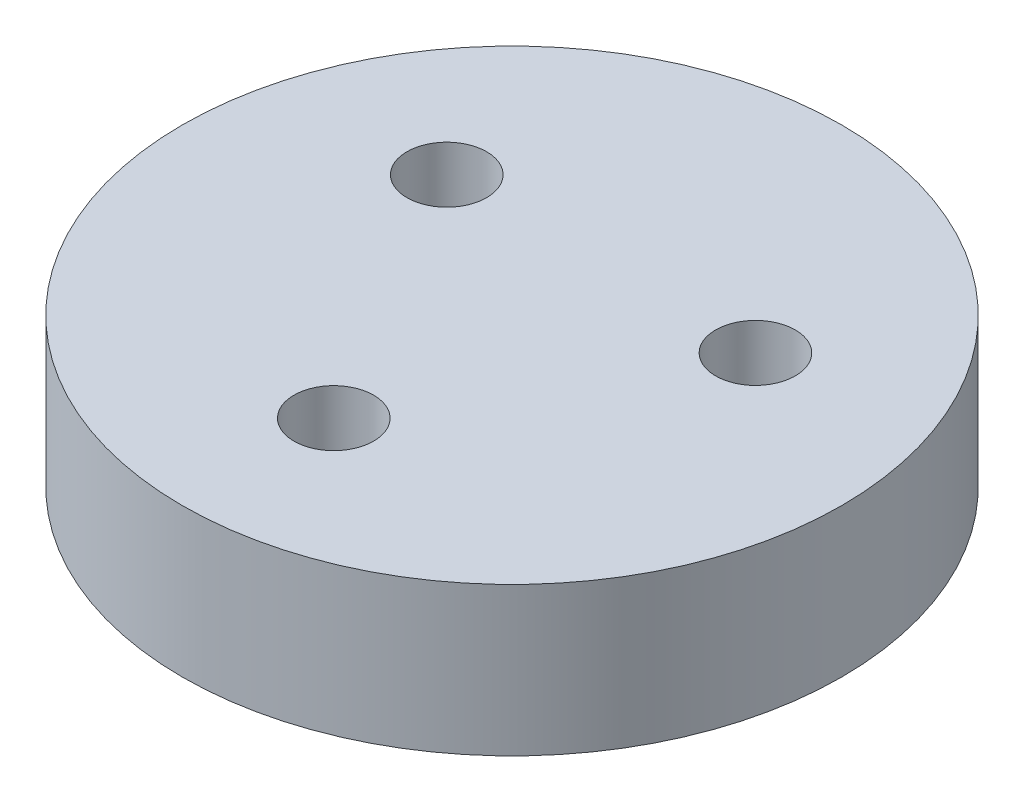
ISO-10303-21;
HEADER;
FILE_DESCRIPTION(('STEP AP214'),'2;1');
FILE_NAME('part.step','',(''),(''),'','','');
FILE_SCHEMA(('AUTOMOTIVE_DESIGN { 1 0 10303 214 1 1 1 1 }'));
ENDSEC;
DATA;
#1=APPLICATION_CONTEXT('core data for automotive mechanical design processes');
#2=APPLICATION_PROTOCOL_DEFINITION('international standard','automotive_design',2000,#1);
#3=PRODUCT_CONTEXT('',#1,'mechanical');
#4=PRODUCT('Part','Part','',(#3));
#5=PRODUCT_RELATED_PRODUCT_CATEGORY('part','',(#4));
#6=PRODUCT_DEFINITION_FORMATION('','',#4);
#7=PRODUCT_DEFINITION_CONTEXT('part definition',#1,'design');
#8=PRODUCT_DEFINITION('design','',#6,#7);
#9=PRODUCT_DEFINITION_SHAPE('','',#8);
#10=(LENGTH_UNIT() NAMED_UNIT(*) SI_UNIT(.MILLI.,.METRE.));
#11=(NAMED_UNIT(*) PLANE_ANGLE_UNIT() SI_UNIT($,.RADIAN.));
#12=(NAMED_UNIT(*) SI_UNIT($,.STERADIAN.) SOLID_ANGLE_UNIT());
#13=UNCERTAINTY_MEASURE_WITH_UNIT(LENGTH_MEASURE(1.E-05),#10,'distance_accuracy_value','');
#14=(GEOMETRIC_REPRESENTATION_CONTEXT(3) GLOBAL_UNCERTAINTY_ASSIGNED_CONTEXT((#13)) GLOBAL_UNIT_ASSIGNED_CONTEXT((#10,
#11,#12)) REPRESENTATION_CONTEXT('',''));
#15=CARTESIAN_POINT('',(0.,0.,0.));
#16=DIRECTION('',(0.,0.,1.));
#17=DIRECTION('',(1.,0.,0.));
#18=AXIS2_PLACEMENT_3D('',#15,#16,#17);
#19=CARTESIAN_POINT('',(0.,15.,0.));
#20=DIRECTION('',(0.,-1.,0.));
#21=DIRECTION('',(0.,0.,-1.));
#22=AXIS2_PLACEMENT_3D('',#19,#20,#21);
#23=CYLINDRICAL_SURFACE('',#22,33.3);
#24=CARTESIAN_POINT('',(0.,15.,0.));
#25=DIRECTION('',(0.,1.,0.));
#26=DIRECTION('',(0.,0.,1.));
#27=AXIS2_PLACEMENT_3D('',#24,#25,#26);
#28=CIRCLE('',#27,33.3);
#29=CARTESIAN_POINT('',(0.,15.,33.3));
#30=VERTEX_POINT('',#29);
#31=EDGE_CURVE('E55',#30,#30,#28,.T.);
#32=ORIENTED_EDGE('',*,*,#31,.F.);
#33=EDGE_LOOP('',(#32));
#34=FACE_BOUND('',#33,.T.);
#35=CARTESIAN_POINT('',(0.,0.,0.));
#36=DIRECTION('',(0.,1.,0.));
#37=DIRECTION('',(0.,0.,1.));
#38=AXIS2_PLACEMENT_3D('',#35,#36,#37);
#39=CIRCLE('',#38,33.3);
#40=CARTESIAN_POINT('',(0.,0.,33.3));
#41=VERTEX_POINT('',#40);
#42=EDGE_CURVE('E60',#41,#41,#39,.T.);
#43=ORIENTED_EDGE('',*,*,#42,.T.);
#44=EDGE_LOOP('',(#43));
#45=FACE_BOUND('',#44,.T.);
#46=ADVANCED_FACE('F42',(#34,#45),#23,.T.);
#47=CARTESIAN_POINT('',(0.,15.,0.));
#48=DIRECTION('',(0.,1.,0.));
#49=DIRECTION('',(0.,0.,1.));
#50=AXIS2_PLACEMENT_3D('',#47,#48,#49);
#51=PLANE('',#50);
#52=CARTESIAN_POINT('',(0.,15.,18.));
#53=DIRECTION('',(0.,-1.,0.));
#54=DIRECTION('',(0.,0.,-1.));
#55=AXIS2_PLACEMENT_3D('',#52,#53,#54);
#56=CIRCLE('',#55,4.025);
#57=CARTESIAN_POINT('',(0.,15.,13.975));
#58=VERTEX_POINT('',#57);
#59=EDGE_CURVE('E65',#58,#58,#56,.T.);
#60=ORIENTED_EDGE('',*,*,#59,.T.);
#61=EDGE_LOOP('',(#60));
#62=FACE_BOUND('',#61,.T.);
#63=CARTESIAN_POINT('',(15.5884572681212,15.,-8.99999999999926));
#64=DIRECTION('',(0.,-1.,0.));
#65=DIRECTION('',(0.,0.,-1.));
#66=AXIS2_PLACEMENT_3D('',#63,#64,#65);
#67=CIRCLE('',#66,4.025);
#68=CARTESIAN_POINT('',(15.5884572681212,15.,-13.0249999999993));
#69=VERTEX_POINT('',#68);
#70=EDGE_CURVE('E76',#69,#69,#67,.T.);
#71=ORIENTED_EDGE('',*,*,#70,.T.);
#72=EDGE_LOOP('',(#71));
#73=FACE_BOUND('',#72,.T.);
#74=CARTESIAN_POINT('',(-15.5884572681186,15.,-9.00000000000073));
#75=DIRECTION('',(0.,-1.,0.));
#76=DIRECTION('',(0.,0.,-1.));
#77=AXIS2_PLACEMENT_3D('',#74,#75,#76);
#78=CIRCLE('',#77,4.025);
#79=CARTESIAN_POINT('',(-15.5884572681186,15.,-13.0250000000007));
#80=VERTEX_POINT('',#79);
#81=EDGE_CURVE('E67',#80,#80,#78,.T.);
#82=ORIENTED_EDGE('',*,*,#81,.T.);
#83=EDGE_LOOP('',(#82));
#84=FACE_BOUND('',#83,.T.);
#85=ORIENTED_EDGE('',*,*,#31,.T.);
#86=EDGE_LOOP('',(#85));
#87=FACE_BOUND('',#86,.T.);
#88=ADVANCED_FACE('F112',(#62,#73,#84,#87),#51,.T.);
#89=CARTESIAN_POINT('',(0.,0.,0.));
#90=DIRECTION('',(0.,1.,0.));
#91=DIRECTION('',(0.,0.,1.));
#92=AXIS2_PLACEMENT_3D('',#89,#90,#91);
#93=PLANE('',#92);
#94=CARTESIAN_POINT('',(0.,0.,0.));
#95=DIRECTION('',(0.,1.,0.));
#96=DIRECTION('',(0.,0.,1.));
#97=AXIS2_PLACEMENT_3D('',#94,#95,#96);
#98=CIRCLE('',#97,10.);
#99=CARTESIAN_POINT('',(0.,0.,10.));
#100=VERTEX_POINT('',#99);
#101=EDGE_CURVE('E10',#100,#100,#98,.T.);
#102=ORIENTED_EDGE('',*,*,#101,.T.);
#103=EDGE_LOOP('',(#102));
#104=FACE_BOUND('',#103,.T.);
#105=CARTESIAN_POINT('',(0.,0.,18.));
#106=DIRECTION('',(0.,-1.,0.));
#107=DIRECTION('',(0.,0.,-1.));
#108=AXIS2_PLACEMENT_3D('',#105,#106,#107);
#109=CIRCLE('',#108,4.025);
#110=CARTESIAN_POINT('',(0.,0.,13.975));
#111=VERTEX_POINT('',#110);
#112=EDGE_CURVE('E84',#111,#111,#109,.T.);
#113=ORIENTED_EDGE('',*,*,#112,.F.);
#114=EDGE_LOOP('',(#113));
#115=FACE_BOUND('',#114,.T.);
#116=CARTESIAN_POINT('',(15.5884572681212,0.,-8.99999999999926));
#117=DIRECTION('',(0.,-1.,0.));
#118=DIRECTION('',(0.,0.,-1.));
#119=AXIS2_PLACEMENT_3D('',#116,#117,#118);
#120=CIRCLE('',#119,4.025);
#121=CARTESIAN_POINT('',(15.5884572681212,0.,-13.0249999999993));
#122=VERTEX_POINT('',#121);
#123=EDGE_CURVE('E80',#122,#122,#120,.T.);
#124=ORIENTED_EDGE('',*,*,#123,.F.);
#125=EDGE_LOOP('',(#124));
#126=FACE_BOUND('',#125,.T.);
#127=CARTESIAN_POINT('',(-15.5884572681186,0.,-9.00000000000073));
#128=DIRECTION('',(0.,-1.,0.));
#129=DIRECTION('',(0.,0.,-1.));
#130=AXIS2_PLACEMENT_3D('',#127,#128,#129);
#131=CIRCLE('',#130,4.025);
#132=CARTESIAN_POINT('',(-15.5884572681186,0.,-13.0250000000007));
#133=VERTEX_POINT('',#132);
#134=EDGE_CURVE('E71',#133,#133,#131,.T.);
#135=ORIENTED_EDGE('',*,*,#134,.F.);
#136=EDGE_LOOP('',(#135));
#137=FACE_BOUND('',#136,.T.);
#138=ORIENTED_EDGE('',*,*,#42,.F.);
#139=EDGE_LOOP('',(#138));
#140=FACE_BOUND('',#139,.T.);
#141=ADVANCED_FACE('F117',(#104,#115,#126,#137,#140),#93,.F.);
#142=CARTESIAN_POINT('',(-15.5884572681186,15.,-9.00000000000073));
#143=DIRECTION('',(0.,-1.,0.));
#144=DIRECTION('',(0.,0.,-1.));
#145=AXIS2_PLACEMENT_3D('',#142,#143,#144);
#146=CYLINDRICAL_SURFACE('',#145,4.025);
#147=ORIENTED_EDGE('',*,*,#81,.F.);
#148=EDGE_LOOP('',(#147));
#149=FACE_BOUND('',#148,.T.);
#150=ORIENTED_EDGE('',*,*,#134,.T.);
#151=EDGE_LOOP('',(#150));
#152=FACE_BOUND('',#151,.T.);
#153=ADVANCED_FACE('F123',(#149,#152),#146,.F.);
#154=CARTESIAN_POINT('',(15.5884572681212,15.,-8.99999999999926));
#155=DIRECTION('',(0.,-1.,0.));
#156=DIRECTION('',(0.,0.,-1.));
#157=AXIS2_PLACEMENT_3D('',#154,#155,#156);
#158=CYLINDRICAL_SURFACE('',#157,4.025);
#159=ORIENTED_EDGE('',*,*,#70,.F.);
#160=EDGE_LOOP('',(#159));
#161=FACE_BOUND('',#160,.T.);
#162=ORIENTED_EDGE('',*,*,#123,.T.);
#163=EDGE_LOOP('',(#162));
#164=FACE_BOUND('',#163,.T.);
#165=ADVANCED_FACE('F108',(#161,#164),#158,.F.);
#166=CARTESIAN_POINT('',(0.,15.,18.));
#167=DIRECTION('',(0.,-1.,0.));
#168=DIRECTION('',(0.,0.,-1.));
#169=AXIS2_PLACEMENT_3D('',#166,#167,#168);
#170=CYLINDRICAL_SURFACE('',#169,4.025);
#171=ORIENTED_EDGE('',*,*,#59,.F.);
#172=EDGE_LOOP('',(#171));
#173=FACE_BOUND('',#172,.T.);
#174=ORIENTED_EDGE('',*,*,#112,.T.);
#175=EDGE_LOOP('',(#174));
#176=FACE_BOUND('',#175,.T.);
#177=ADVANCED_FACE('F99',(#173,#176),#170,.F.);
#178=CARTESIAN_POINT('',(0.,-10.,0.));
#179=DIRECTION('',(0.,1.,0.));
#180=DIRECTION('',(0.,0.,1.));
#181=AXIS2_PLACEMENT_3D('',#178,#179,#180);
#182=CYLINDRICAL_SURFACE('',#181,7.5);
#183=CARTESIAN_POINT('',(0.,-2.5,0.));
#184=DIRECTION('',(0.,1.,0.));
#185=DIRECTION('',(0.,0.,1.));
#186=AXIS2_PLACEMENT_3D('',#183,#184,#185);
#187=CIRCLE('',#186,7.5);
#188=CARTESIAN_POINT('',(0.,-2.5,7.5));
#189=VERTEX_POINT('',#188);
#190=EDGE_CURVE('E50',#189,#189,#187,.F.);
#191=ORIENTED_EDGE('',*,*,#190,.T.);
#192=EDGE_LOOP('',(#191));
#193=FACE_BOUND('',#192,.T.);
#194=CARTESIAN_POINT('',(0.,-10.,0.));
#195=DIRECTION('',(0.,-1.,0.));
#196=DIRECTION('',(0.,0.,-1.));
#197=AXIS2_PLACEMENT_3D('',#194,#195,#196);
#198=CIRCLE('',#197,7.5);
#199=CARTESIAN_POINT('',(0.,-10.,-7.5));
#200=VERTEX_POINT('',#199);
#201=EDGE_CURVE('E72',#200,#200,#198,.T.);
#202=ORIENTED_EDGE('',*,*,#201,.F.);
#203=EDGE_LOOP('',(#202));
#204=FACE_BOUND('',#203,.T.);
#205=ADVANCED_FACE('F97',(#193,#204),#182,.T.);
#206=CARTESIAN_POINT('',(0.,-10.,0.));
#207=DIRECTION('',(0.,-1.,0.));
#208=DIRECTION('',(0.,0.,-1.));
#209=AXIS2_PLACEMENT_3D('',#206,#207,#208);
#210=PLANE('',#209);
#211=ORIENTED_EDGE('',*,*,#201,.T.);
#212=EDGE_LOOP('',(#211));
#213=FACE_BOUND('',#212,.T.);
#214=ADVANCED_FACE('F95',(#213),#210,.T.);
#215=CARTESIAN_POINT('',(0.,-2.5,0.));
#216=DIRECTION('',(0.,1.,0.));
#217=DIRECTION('',(0.,0.,1.));
#218=AXIS2_PLACEMENT_3D('',#215,#216,#217);
#219=TOROIDAL_SURFACE('',#218,10.,2.5);
#220=ORIENTED_EDGE('',*,*,#101,.F.);
#221=EDGE_LOOP('',(#220));
#222=FACE_BOUND('',#221,.T.);
#223=ORIENTED_EDGE('',*,*,#190,.F.);
#224=EDGE_LOOP('',(#223));
#225=FACE_BOUND('',#224,.T.);
#226=ADVANCED_FACE('F44',(#222,#225),#219,.F.);
#227=CLOSED_SHELL('',(#46,#88,#141,#153,#165,#177,#205,#214,#226));
#228=MANIFOLD_SOLID_BREP('B2',#227);
#229=ADVANCED_BREP_SHAPE_REPRESENTATION('',(#18,#228),#14);
#230=SHAPE_DEFINITION_REPRESENTATION(#9,#229);
ENDSEC;
END-ISO-10303-21;
